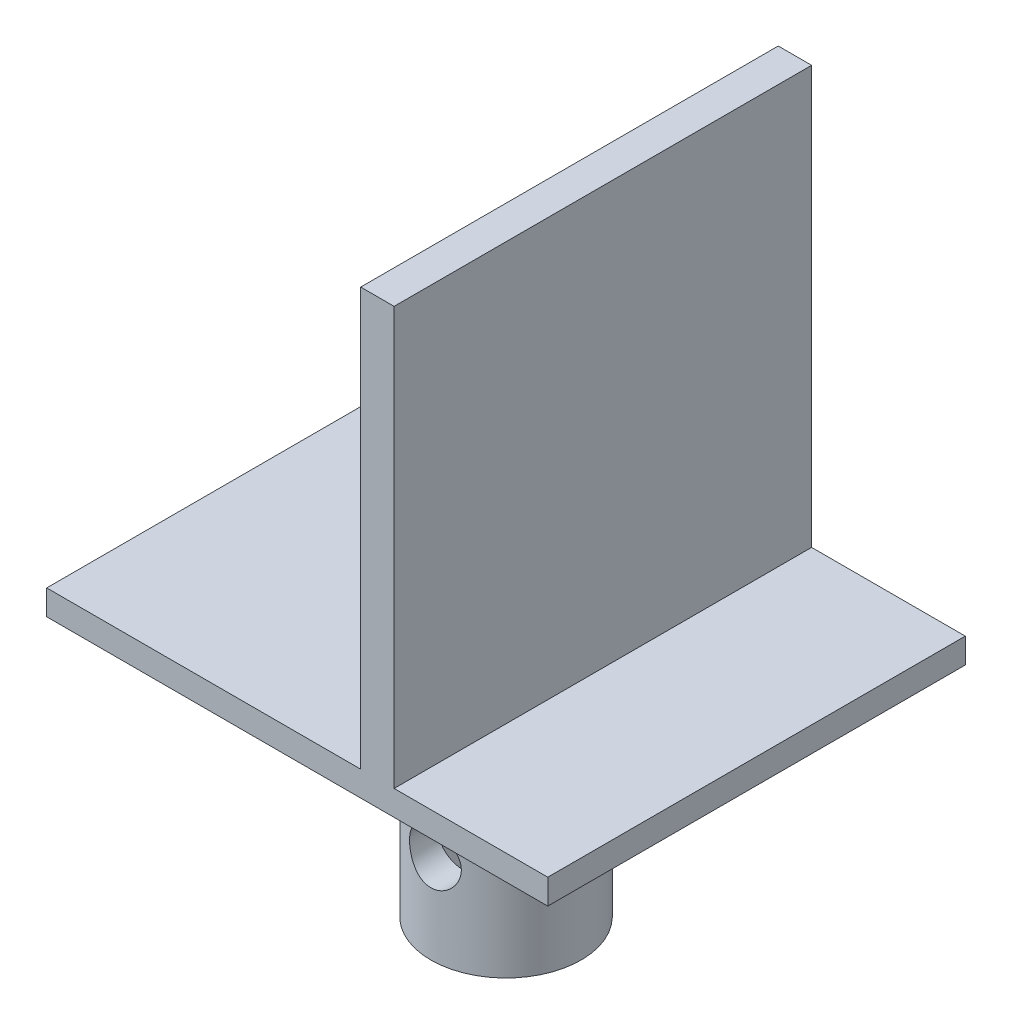
ISO-10303-21;
HEADER;
FILE_DESCRIPTION(('STEP AP214'),'2;1');
FILE_NAME('part.step','',(''),(''),'','','');
FILE_SCHEMA(('AUTOMOTIVE_DESIGN { 1 0 10303 214 1 1 1 1 }'));
ENDSEC;
DATA;
#1=APPLICATION_CONTEXT('core data for automotive mechanical design processes');
#2=APPLICATION_PROTOCOL_DEFINITION('international standard','automotive_design',2000,#1);
#3=PRODUCT_CONTEXT('',#1,'mechanical');
#4=PRODUCT('Part','Part','',(#3));
#5=PRODUCT_RELATED_PRODUCT_CATEGORY('part','',(#4));
#6=PRODUCT_DEFINITION_FORMATION('','',#4);
#7=PRODUCT_DEFINITION_CONTEXT('part definition',#1,'design');
#8=PRODUCT_DEFINITION('design','',#6,#7);
#9=PRODUCT_DEFINITION_SHAPE('','',#8);
#10=(LENGTH_UNIT() NAMED_UNIT(*) SI_UNIT(.MILLI.,.METRE.));
#11=(NAMED_UNIT(*) PLANE_ANGLE_UNIT() SI_UNIT($,.RADIAN.));
#12=(NAMED_UNIT(*) SI_UNIT($,.STERADIAN.) SOLID_ANGLE_UNIT());
#13=UNCERTAINTY_MEASURE_WITH_UNIT(LENGTH_MEASURE(1.E-05),#10,'distance_accuracy_value','');
#14=(GEOMETRIC_REPRESENTATION_CONTEXT(3) GLOBAL_UNCERTAINTY_ASSIGNED_CONTEXT((#13)) GLOBAL_UNIT_ASSIGNED_CONTEXT((#10,
#11,#12)) REPRESENTATION_CONTEXT('',''));
#15=CARTESIAN_POINT('',(0.,0.,0.));
#16=DIRECTION('',(0.,0.,1.));
#17=DIRECTION('',(1.,0.,0.));
#18=AXIS2_PLACEMENT_3D('',#15,#16,#17);
#19=CARTESIAN_POINT('',(0.,15.8,0.));
#20=DIRECTION('',(0.,-1.,0.));
#21=DIRECTION('',(0.,0.,-1.));
#22=AXIS2_PLACEMENT_3D('',#19,#20,#21);
#23=PLANE('',#22);
#24=DIRECTION('',(0.,0.,-1.));
#25=VECTOR('',#24,1.);
#26=CARTESIAN_POINT('',(5.8,15.8,12.5));
#27=LINE('',#26,#25);
#28=CARTESIAN_POINT('',(5.8,15.8,12.5));
#29=VERTEX_POINT('',#28);
#30=CARTESIAN_POINT('',(5.8,15.8,-12.5));
#31=VERTEX_POINT('',#30);
#32=EDGE_CURVE('E55',#29,#31,#27,.T.);
#33=ORIENTED_EDGE('',*,*,#32,.F.);
#34=DIRECTION('',(1.,0.,0.));
#35=VECTOR('',#34,1.);
#36=CARTESIAN_POINT('',(-15.,15.8,12.5));
#37=LINE('',#36,#35);
#38=CARTESIAN_POINT('',(15.,15.8,12.5));
#39=VERTEX_POINT('',#38);
#40=EDGE_CURVE('E160',#29,#39,#37,.T.);
#41=ORIENTED_EDGE('',*,*,#40,.T.);
#42=DIRECTION('',(0.,0.,-1.));
#43=VECTOR('',#42,1.);
#44=CARTESIAN_POINT('',(15.,15.8,12.5));
#45=LINE('',#44,#43);
#46=CARTESIAN_POINT('',(15.,15.8,-12.5));
#47=VERTEX_POINT('',#46);
#48=EDGE_CURVE('E152',#39,#47,#45,.T.);
#49=ORIENTED_EDGE('',*,*,#48,.T.);
#50=DIRECTION('',(-1.,0.,0.));
#51=VECTOR('',#50,1.);
#52=CARTESIAN_POINT('',(-15.,15.8,-12.5));
#53=LINE('',#52,#51);
#54=EDGE_CURVE('E156',#47,#31,#53,.T.);
#55=ORIENTED_EDGE('',*,*,#54,.T.);
#56=EDGE_LOOP('',(#33,#41,#49,#55));
#57=FACE_BOUND('',#56,.T.);
#58=ADVANCED_FACE('F37',(#57),#23,.F.);
#59=CARTESIAN_POINT('',(0.,15.8,0.));
#60=DIRECTION('',(0.,1.,0.));
#61=DIRECTION('',(0.,0.,1.));
#62=AXIS2_PLACEMENT_3D('',#59,#60,#61);
#63=CIRCLE('',#62,1.6);
#64=CARTESIAN_POINT('',(0.,15.8,1.6));
#65=VERTEX_POINT('',#64);
#66=EDGE_CURVE('E140',#65,#65,#63,.T.);
#67=ORIENTED_EDGE('',*,*,#66,.F.);
#68=EDGE_LOOP('',(#67));
#69=FACE_BOUND('',#68,.T.);
#70=DIRECTION('',(0.,0.,1.));
#71=VECTOR('',#70,1.);
#72=CARTESIAN_POINT('',(3.8,15.8,-12.5));
#73=LINE('',#72,#71);
#74=CARTESIAN_POINT('',(3.8,15.8,-12.5));
#75=VERTEX_POINT('',#74);
#76=CARTESIAN_POINT('',(3.8,15.8,12.5));
#77=VERTEX_POINT('',#76);
#78=EDGE_CURVE('E63',#75,#77,#73,.T.);
#79=ORIENTED_EDGE('',*,*,#78,.F.);
#80=CARTESIAN_POINT('',(-15.,15.8,-12.5));
#81=VERTEX_POINT('',#80);
#82=EDGE_CURVE('E139',#75,#81,#53,.T.);
#83=ORIENTED_EDGE('',*,*,#82,.T.);
#84=DIRECTION('',(0.,0.,1.));
#85=VECTOR('',#84,1.);
#86=CARTESIAN_POINT('',(-15.,15.8,12.5));
#87=LINE('',#86,#85);
#88=CARTESIAN_POINT('',(-15.,15.8,12.5));
#89=VERTEX_POINT('',#88);
#90=EDGE_CURVE('E158',#81,#89,#87,.T.);
#91=ORIENTED_EDGE('',*,*,#90,.T.);
#92=EDGE_CURVE('E161',#89,#77,#37,.T.);
#93=ORIENTED_EDGE('',*,*,#92,.T.);
#94=EDGE_LOOP('',(#79,#83,#91,#93));
#95=FACE_BOUND('',#94,.T.);
#96=ADVANCED_FACE('F241',(#69,#95),#23,.F.);
#97=CARTESIAN_POINT('',(0.,0.,0.));
#98=DIRECTION('',(0.,1.,0.));
#99=DIRECTION('',(0.,0.,1.));
#100=AXIS2_PLACEMENT_3D('',#97,#98,#99);
#101=PLANE('',#100);
#102=CARTESIAN_POINT('',(0.,0.,0.));
#103=DIRECTION('',(0.,1.,0.));
#104=DIRECTION('',(0.,0.,1.));
#105=AXIS2_PLACEMENT_3D('',#102,#103,#104);
#106=CIRCLE('',#105,4.5);
#107=CARTESIAN_POINT('',(0.,0.,4.5));
#108=VERTEX_POINT('',#107);
#109=EDGE_CURVE('E47',#108,#108,#106,.T.);
#110=ORIENTED_EDGE('',*,*,#109,.F.);
#111=EDGE_LOOP('',(#110));
#112=FACE_BOUND('',#111,.T.);
#113=CARTESIAN_POINT('',(0.,0.,0.));
#114=DIRECTION('',(0.,1.,0.));
#115=DIRECTION('',(0.,0.,1.));
#116=AXIS2_PLACEMENT_3D('',#113,#114,#115);
#117=CIRCLE('',#116,3.1);
#118=CARTESIAN_POINT('',(0.,0.,3.1));
#119=VERTEX_POINT('',#118);
#120=EDGE_CURVE('E228',#119,#119,#117,.T.);
#121=ORIENTED_EDGE('',*,*,#120,.T.);
#122=EDGE_LOOP('',(#121));
#123=FACE_BOUND('',#122,.T.);
#124=ADVANCED_FACE('F238',(#112,#123),#101,.F.);
#125=CARTESIAN_POINT('',(0.,14.3,0.));
#126=DIRECTION('',(0.,-1.,0.));
#127=DIRECTION('',(0.,0.,-1.));
#128=AXIS2_PLACEMENT_3D('',#125,#126,#127);
#129=CYLINDRICAL_SURFACE('',#128,4.5);
#130=CARTESIAN_POINT('',(0.,6.85,-4.5));
#131=CARTESIAN_POINT('',(-0.0844112457578997,6.85000098688728,-4.50000067498475));
#132=CARTESIAN_POINT('',(-0.168815510914255,6.84308235298128,-4.49760331814558));
#133=CARTESIAN_POINT('',(-0.335128310504061,6.81568220562156,-4.488276751476));
#134=CARTESIAN_POINT('',(-0.417036750892387,6.79520018174544,-4.48134737109495));
#135=CARTESIAN_POINT('',(-0.575936267944437,6.74146537536155,-4.46370738435514));
#136=CARTESIAN_POINT('',(-0.652935626003491,6.70823480160922,-4.45300335626998));
#137=CARTESIAN_POINT('',(-0.800266823584256,6.63004981513081,-4.42889974185601));
#138=CARTESIAN_POINT('',(-0.87059720834899,6.58509285241819,-4.41549956937654));
#139=CARTESIAN_POINT('',(-1.00517392756136,6.4830015946162,-4.38685738369943));
#140=CARTESIAN_POINT('',(-1.06914216474409,6.42551377606433,-4.37156911713487));
#141=CARTESIAN_POINT('',(-1.18674533040204,6.30074387775322,-4.34112114551387));
#142=CARTESIAN_POINT('',(-1.24037777182549,6.23345944750391,-4.32596147223702));
#143=CARTESIAN_POINT('',(-1.33741979634218,6.08844839462504,-4.29697089006417));
#144=CARTESIAN_POINT('',(-1.38045991867064,6.01046225677719,-4.28319591070303));
#145=CARTESIAN_POINT('',(-1.45269327295272,5.8478075859434,-4.25924185592437));
#146=CARTESIAN_POINT('',(-1.48189105943343,5.76314126164097,-4.24906159802171));
#147=CARTESIAN_POINT('',(-1.52455348914785,5.59270357415113,-4.23393854741069));
#148=CARTESIAN_POINT('',(-1.53854191577049,5.50707921252927,-4.2288219757491));
#149=CARTESIAN_POINT('',(-1.55202626307294,5.33455757176489,-4.22389287384626));
#150=CARTESIAN_POINT('',(-1.55152702780461,5.24766072779854,-4.22407857075382));
#151=CARTESIAN_POINT('',(-1.5364552893331,5.07960717729957,-4.22958135760731));
#152=CARTESIAN_POINT('',(-1.52257679429198,4.99837848064107,-4.23464538950798));
#153=CARTESIAN_POINT('',(-1.48227653208473,4.83948210457874,-4.24891851388564));
#154=CARTESIAN_POINT('',(-1.45585316715558,4.76181488015989,-4.25812813435304));
#155=CARTESIAN_POINT('',(-1.39077825177585,4.61071147944572,-4.27982769024448));
#156=CARTESIAN_POINT('',(-1.35192777452719,4.53736887987872,-4.29237038476014));
#157=CARTESIAN_POINT('',(-1.2632396196249,4.39802921480025,-4.31930189756565));
#158=CARTESIAN_POINT('',(-1.21339859933375,4.33203439323379,-4.33369127694408));
#159=CARTESIAN_POINT('',(-1.10085151292632,4.20537803630775,-4.36367934319863));
#160=CARTESIAN_POINT('',(-1.03758136833315,4.14522201528507,-4.37930062966038));
#161=CARTESIAN_POINT('',(-0.901661158563292,4.03623742852,-4.40929074897612));
#162=CARTESIAN_POINT('',(-0.829010068918356,3.98741010158565,-4.42365944475048));
#163=CARTESIAN_POINT('',(-0.675262923964719,3.90202470989667,-4.4497369357377));
#164=CARTESIAN_POINT('',(-0.594081261287455,3.86561045459386,-4.46141407767136));
#165=CARTESIAN_POINT('',(-0.426244860993738,3.80711528264219,-4.4805619129214));
#166=CARTESIAN_POINT('',(-0.339592172411808,3.78502903433439,-4.48803417079866));
#167=CARTESIAN_POINT('',(-0.167546658901882,3.75673179177389,-4.49766704671657));
#168=CARTESIAN_POINT('',(-0.0822787133035284,3.74983835233336,-4.50005582746344));
#169=CARTESIAN_POINT('',(0.0882177823376301,3.75016733661719,-4.49994221303783));
#170=CARTESIAN_POINT('',(0.173446336725034,3.7573871931293,-4.49744070740972));
#171=CARTESIAN_POINT('',(0.338657836079041,3.78520276696595,-4.48797835218554));
#172=CARTESIAN_POINT('',(0.418721468906692,3.80537242219893,-4.48115963905442));
#173=CARTESIAN_POINT('',(0.57429040049466,3.8579751591538,-4.46389080403277));
#174=CARTESIAN_POINT('',(0.649795110227239,3.89040982163944,-4.45344021406533));
#175=CARTESIAN_POINT('',(0.796398179598675,3.96759637989019,-4.42960707813092));
#176=CARTESIAN_POINT('',(0.867320514776627,4.0126596924286,-4.41615242861785));
#177=CARTESIAN_POINT('',(1.00081442868829,4.11346241327732,-4.38782802560196));
#178=CARTESIAN_POINT('',(1.06338329670506,4.16920527290276,-4.37295781541538));
#179=CARTESIAN_POINT('',(1.18156817866963,4.292989962079,-4.34255718231333));
#180=CARTESIAN_POINT('',(1.23669749306648,4.36149838952029,-4.32702985654681));
#181=CARTESIAN_POINT('',(1.33474670692027,4.50712218172922,-4.29779911143196));
#182=CARTESIAN_POINT('',(1.37766629660505,4.58423776479939,-4.28409573836372));
#183=CARTESIAN_POINT('',(1.44992864430844,4.74505107230025,-4.26018344938775));
#184=CARTESIAN_POINT('',(1.47928119530185,4.82874399784877,-4.24997201431499));
#185=CARTESIAN_POINT('',(1.52332795379709,5.00032260300098,-4.23438643444276));
#186=CARTESIAN_POINT('',(1.53802936678966,5.08820619930873,-4.22900991194032));
#187=CARTESIAN_POINT('',(1.55177178830967,5.26049292340695,-4.22398537227285));
#188=CARTESIAN_POINT('',(1.55162612410019,5.34482317529373,-4.22403984010122));
#189=CARTESIAN_POINT('',(1.53770139040204,5.51218948644983,-4.22912853088892));
#190=CARTESIAN_POINT('',(1.5239232412872,5.59522563270406,-4.23416241767132));
#191=CARTESIAN_POINT('',(1.48371636052575,5.75584501502134,-4.24841411375326));
#192=CARTESIAN_POINT('',(1.45756832353841,5.83350743489417,-4.25753886486137));
#193=CARTESIAN_POINT('',(1.39359582829707,5.98339970249702,-4.27890436288881));
#194=CARTESIAN_POINT('',(1.3557686725035,6.05562829037038,-4.29114582956486));
#195=CARTESIAN_POINT('',(1.26748274106293,6.19620885987046,-4.31806759352077));
#196=CARTESIAN_POINT('',(1.21652268740575,6.26422937627379,-4.33283421217731));
#197=CARTESIAN_POINT('',(1.10424618396128,6.3910155842314,-4.36279870574256));
#198=CARTESIAN_POINT('',(1.04292671332931,6.44977856656719,-4.37799670536496));
#199=CARTESIAN_POINT('',(0.908533164448209,6.55891758107121,-4.40789038140682));
#200=CARTESIAN_POINT('',(0.83506911752254,6.60882865669005,-4.4225369396473));
#201=CARTESIAN_POINT('',(0.680301484696209,6.69554778519266,-4.44897093345745));
#202=CARTESIAN_POINT('',(0.598999273220981,6.73235813000325,-4.46075886901803));
#203=CARTESIAN_POINT('',(0.432700101686367,6.79092776983934,-4.47991225805818));
#204=CARTESIAN_POINT('',(0.347826133026447,6.81300470498523,-4.48737056011597));
#205=CARTESIAN_POINT('',(0.17529832568854,6.84253793166177,-4.49741328859762));
#206=CARTESIAN_POINT('',(0.0876453999632326,6.84999897530087,-4.49999929915371));
#207=CARTESIAN_POINT('',(0.,6.85,-4.5));
#208=B_SPLINE_CURVE_WITH_KNOTS('',3,(#130,#131,#132,#133,#134,#135,#136,#137,#138,#139,#140,
#141,#142,#143,#144,#145,#146,#147,#148,#149,#150,#151,#152,#153,#154,#155,#156,#157,#158,#159,
#160,#161,#162,#163,#164,#165,#166,#167,#168,#169,#170,#171,#172,#173,#174,#175,#176,#177,#178,
#179,#180,#181,#182,#183,#184,#185,#186,#187,#188,#189,#190,#191,#192,#193,#194,#195,#196,#197,
#198,#199,#200,#201,#202,#203,#204,#205,#206,#207),.UNSPECIFIED.,.T.,.F.,(4,2,2,2,2,2,2,2,2,2,2,
2,2,2,2,2,2,2,2,2,2,2,2,2,2,2,2,2,2,2,2,2,2,2,2,2,2,2,4),(0.,0.252911005872154,0.50583152992377,
0.758313437091753,1.01085029408286,1.27173813706169,1.53268867803223,1.80174816030347,
2.07071905271088,2.33010103515682,2.58939629240825,2.83592697222035,3.08248905955764,
3.33321407090094,3.58401544258284,3.84885953372345,4.11373257228915,4.38157751679093,
4.64932273505168,4.90477259769653,5.1601759982677,5.40757928022737,5.65501445939691,
5.90918889170316,6.16344560468376,6.43007880381508,6.69671876707778,6.96316596225806,
7.22948205283423,7.48121755498931,7.73293606281367,7.97919818757991,8.22551723439856,
8.48317411129175,8.74090625198943,9.00963762937433,9.27832197001198,9.54100849552516,
9.8036095987993),.UNSPECIFIED.);
#209=CARTESIAN_POINT('',(0.,6.85,-4.5));
#210=VERTEX_POINT('',#209);
#211=EDGE_CURVE('E211',#210,#210,#208,.T.);
#212=ORIENTED_EDGE('',*,*,#211,.T.);
#213=EDGE_LOOP('',(#212));
#214=FACE_BOUND('',#213,.T.);
#215=CARTESIAN_POINT('',(1.55,5.3,4.22463016132773));
#216=CARTESIAN_POINT('',(1.55000101648973,5.21575674611695,4.22462932996597));
#217=CARTESIAN_POINT('',(1.54310886725736,5.13152053455058,4.22717750648441));
#218=CARTESIAN_POINT('',(1.51582348983939,4.96555518183629,4.23703733210377));
#219=CARTESIAN_POINT('',(1.49542877799695,4.88382631722749,4.24434950466951));
#220=CARTESIAN_POINT('',(1.44194888576098,4.72530917372356,4.26281291866779));
#221=CARTESIAN_POINT('',(1.40888995559925,4.64851105636324,4.27395621413117));
#222=CARTESIAN_POINT('',(1.33111065768993,4.50152458504806,4.29881443706124));
#223=CARTESIAN_POINT('',(1.28638745331447,4.43133784456928,4.3125299898454));
#224=CARTESIAN_POINT('',(1.18454604444956,4.29663183678457,4.34163034204318));
#225=CARTESIAN_POINT('',(1.12702162336343,4.2324290225721,4.3570587527152));
#226=CARTESIAN_POINT('',(1.00207632126868,4.11436394240221,4.38747908186884));
#227=CARTESIAN_POINT('',(0.934653730287424,4.06050346686855,4.40247092439313));
#228=CARTESIAN_POINT('',(0.789489383833411,3.96319372365394,4.43083730162968));
#229=CARTESIAN_POINT('',(0.711511062274522,3.92007920049043,4.44415461436952));
#230=CARTESIAN_POINT('',(0.548870506500739,3.84770641767961,4.46715495887712));
#231=CARTESIAN_POINT('',(0.464210212297967,3.81844415337348,4.47683904083607));
#232=CARTESIAN_POINT('',(0.29392922284534,3.77568899554056,4.49117272513203));
#233=CARTESIAN_POINT('',(0.208459638580764,3.76165330536828,4.49599515208323));
#234=CARTESIAN_POINT('',(0.0362514239351594,3.74802041761557,4.50067737170093));
#235=CARTESIAN_POINT('',(-0.050486851105961,3.74841925173279,4.50053852830727));
#236=CARTESIAN_POINT('',(-0.218915947468002,3.76330698916361,4.49542914182594));
#237=CARTESIAN_POINT('',(-0.300666104758727,3.77720562287302,4.4906610148277));
#238=CARTESIAN_POINT('',(-0.460593440438585,3.81771802117257,4.47708585415062));
#239=CARTESIAN_POINT('',(-0.538770372448995,3.84433266110381,4.46827854242512));
#240=CARTESIAN_POINT('',(-0.69058356440591,3.90984756288369,4.44736445838373));
#241=CARTESIAN_POINT('',(-0.764143765640562,3.94890971934316,4.43521451312276));
#242=CARTESIAN_POINT('',(-0.903834591153738,4.03807512496967,4.4088709798034));
#243=CARTESIAN_POINT('',(-0.96996304605704,4.08818158546662,4.39467679776334));
#244=CARTESIAN_POINT('',(-1.09641742517555,4.20095521223963,4.36489409089641));
#245=CARTESIAN_POINT('',(-1.15628719891386,4.26412557475527,4.34927133584979));
#246=CARTESIAN_POINT('',(-1.26473733477207,4.39973388083113,4.31898340257333));
#247=CARTESIAN_POINT('',(-1.31331570274819,4.47217345790429,4.30431839381672));
#248=CARTESIAN_POINT('',(-1.39849441029571,4.62579865875816,4.27741142495602));
#249=CARTESIAN_POINT('',(-1.43488891406876,4.70710650501841,4.26521236224826));
#250=CARTESIAN_POINT('',(-1.49331005957463,4.87522420772478,4.24511376491246));
#251=CARTESIAN_POINT('',(-1.51534321620687,4.9620315497361,4.23721228099511));
#252=CARTESIAN_POINT('',(-1.54345989663797,5.13424069140105,4.2270492877295));
#253=CARTESIAN_POINT('',(-1.55025534009948,5.21951140009021,4.22453628728762));
#254=CARTESIAN_POINT('',(-1.54973008831735,5.3899935917644,4.22472938157166));
#255=CARTESIAN_POINT('',(-1.5424121851587,5.47520508312841,4.22743444399283));
#256=CARTESIAN_POINT('',(-1.51450933995046,5.63981005215849,4.23750688917032));
#257=CARTESIAN_POINT('',(-1.4944327938826,5.71930185200918,4.24469542272365));
#258=CARTESIAN_POINT('',(-1.44220010638519,5.87376773781414,4.26272411644448));
#259=CARTESIAN_POINT('',(-1.41004173385307,5.94874098637639,4.27356495102959));
#260=CARTESIAN_POINT('',(-1.33334369890451,6.09481148794107,4.29812319571649));
#261=CARTESIAN_POINT('',(-1.28842730579839,6.16569645192045,4.31192439423392));
#262=CARTESIAN_POINT('',(-1.18790826451313,6.29917945434685,4.3406915189207));
#263=CARTESIAN_POINT('',(-1.13230226325512,6.36177488212863,4.35565780967325));
#264=CARTESIAN_POINT('',(-1.00855656849839,6.48026480725094,4.3860086827864));
#265=CARTESIAN_POINT('',(-0.939915967490389,6.53564254809802,4.40137462925332));
#266=CARTESIAN_POINT('',(-0.793937115000877,6.6341343855078,4.43003259095419));
#267=CARTESIAN_POINT('',(-0.716599105111644,6.67724882259707,4.44332466377068));
#268=CARTESIAN_POINT('',(-0.555737105079663,6.74961532168857,4.4662859281167));
#269=CARTESIAN_POINT('',(-0.472253229090395,6.77894940728158,4.47597648260678));
#270=CARTESIAN_POINT('',(-0.301134538547422,6.82302850175413,4.49073257772297));
#271=CARTESIAN_POINT('',(-0.21350134979431,6.83777917599928,4.49579991431831));
#272=CARTESIAN_POINT('',(-0.0412828673221117,6.85173604130049,4.50059402387461));
#273=CARTESIAN_POINT('',(0.0432360325963029,6.85168185445784,4.50057490745951));
#274=CARTESIAN_POINT('',(0.211004563751867,6.83787502629974,4.49583336026566));
#275=CARTESIAN_POINT('',(0.294254309279125,6.824123625935,4.49111135556282));
#276=CARTESIAN_POINT('',(0.455627579809447,6.78381242361161,4.47759418085758));
#277=CARTESIAN_POINT('',(0.533816226343149,6.75748652286772,4.46887350517174));
#278=CARTESIAN_POINT('',(0.684691665398952,6.69299387858438,4.44825823776633));
#279=CARTESIAN_POINT('',(0.757377439817753,6.65482495055758,4.43636306055564));
#280=CARTESIAN_POINT('',(0.898234527273862,6.56604492618065,4.41004618867863));
#281=CARTESIAN_POINT('',(0.966124782811378,6.51501184091004,4.39554493246377));
#282=CARTESIAN_POINT('',(1.09261664927526,6.40265589163046,4.36582389443807));
#283=CARTESIAN_POINT('',(1.1512151842788,6.34132963395123,4.35060387684407));
#284=CARTESIAN_POINT('',(1.26000553156077,6.20701002154622,4.32038341639379));
#285=CARTESIAN_POINT('',(1.3097331041833,6.1336310510546,4.30541992218734));
#286=CARTESIAN_POINT('',(1.39612804645191,5.97908684559913,4.27818744490014));
#287=CARTESIAN_POINT('',(1.43279770519098,5.89792297852169,4.26591798969067));
#288=CARTESIAN_POINT('',(1.49114128767276,5.73192407834298,4.24587270975996));
#289=CARTESIAN_POINT('',(1.51313633197313,5.64721399011321,4.23800131627066));
#290=CARTESIAN_POINT('',(1.5425621631624,5.47499929223424,4.22738152800979));
#291=CARTESIAN_POINT('',(1.54999894426407,5.38749584780914,4.224631024788));
#292=CARTESIAN_POINT('',(1.55,5.3,4.22463016132773));
#293=B_SPLINE_CURVE_WITH_KNOTS('',3,(#215,#216,#217,#218,#219,#220,#221,#222,#223,#224,#225,
#226,#227,#228,#229,#230,#231,#232,#233,#234,#235,#236,#237,#238,#239,#240,#241,#242,#243,#244,
#245,#246,#247,#248,#249,#250,#251,#252,#253,#254,#255,#256,#257,#258,#259,#260,#261,#262,#263,
#264,#265,#266,#267,#268,#269,#270,#271,#272,#273,#274,#275,#276,#277,#278,#279,#280,#281,#282,
#283,#284,#285,#286,#287,#288,#289,#290,#291,#292),.UNSPECIFIED.,.T.,.F.,(4,2,2,2,2,2,2,2,2,2,2,
2,2,2,2,2,2,2,2,2,2,2,2,2,2,2,2,2,2,2,2,2,2,2,2,2,2,2,4),(0.,0.252405285294266,
0.504838309396534,0.756750900179922,1.00872481065168,1.27026776159797,1.53185594906038,
1.80078816116429,2.06964257798011,2.32856143627173,2.58740911379657,2.83542581795459,
3.08345959748178,3.3348609043876,3.5863354074002,3.85039786665386,4.11450692587036,
4.38287589322982,4.65112303246934,4.90655048812577,5.16192741699874,5.40771678296066,
5.65355156018974,5.9075748883732,6.16167802810603,6.42897625359523,6.69626705604106,
6.96194607193487,7.22752183620541,7.47983250373037,7.73212031429765,7.97988791025925,
8.22770123500711,8.48504341446102,8.74247060718338,9.0108597982636,9.27920191669358,
9.54146046082689,9.80361100001415),.UNSPECIFIED.);
#294=CARTESIAN_POINT('',(1.55,5.3,4.22463016132773));
#295=VERTEX_POINT('',#294);
#296=EDGE_CURVE('E190',#295,#295,#293,.T.);
#297=ORIENTED_EDGE('',*,*,#296,.T.);
#298=EDGE_LOOP('',(#297));
#299=FACE_BOUND('',#298,.T.);
#300=CARTESIAN_POINT('',(0.,14.3,0.));
#301=DIRECTION('',(0.,1.,0.));
#302=DIRECTION('',(0.,0.,1.));
#303=AXIS2_PLACEMENT_3D('',#300,#301,#302);
#304=CIRCLE('',#303,4.5);
#305=CARTESIAN_POINT('',(0.,14.3,4.5));
#306=VERTEX_POINT('',#305);
#307=EDGE_CURVE('E11',#306,#306,#304,.T.);
#308=ORIENTED_EDGE('',*,*,#307,.F.);
#309=EDGE_LOOP('',(#308));
#310=FACE_BOUND('',#309,.T.);
#311=ORIENTED_EDGE('',*,*,#109,.T.);
#312=EDGE_LOOP('',(#311));
#313=FACE_BOUND('',#312,.T.);
#314=ADVANCED_FACE('F39',(#214,#299,#310,#313),#129,.T.);
#315=CARTESIAN_POINT('',(0.,14.3,0.));
#316=DIRECTION('',(0.,-1.,0.));
#317=DIRECTION('',(0.,0.,-1.));
#318=AXIS2_PLACEMENT_3D('',#315,#316,#317);
#319=CYLINDRICAL_SURFACE('',#318,3.1);
#320=CARTESIAN_POINT('',(0.,6.85,-3.1));
#321=CARTESIAN_POINT('',(-0.0814865425744118,6.84999488140835,-3.09999555777814));
#322=CARTESIAN_POINT('',(-0.163070229531222,6.84353638666236,-3.09675261080622));
#323=CARTESIAN_POINT('',(-0.323826364666789,6.81798803547062,-3.08409941857593));
#324=CARTESIAN_POINT('',(-0.402993934406126,6.79887419085339,-3.07467746134825));
#325=CARTESIAN_POINT('',(-0.556346994564696,6.74894959664423,-3.05065233075232));
#326=CARTESIAN_POINT('',(-0.630550544555677,6.71818430441565,-3.03606930725183));
#327=CARTESIAN_POINT('',(-0.772632556050228,6.64606553688427,-3.0030595359943));
#328=CARTESIAN_POINT('',(-0.840511515684591,6.60471289641426,-2.98463309131964));
#329=CARTESIAN_POINT('',(-0.972637117530959,6.50974826329781,-2.94432200299996));
#330=CARTESIAN_POINT('',(-1.03641557723927,6.45554595717856,-2.92229558647683));
#331=CARTESIAN_POINT('',(-1.15440813954382,6.33769170716709,-2.87772953882452));
#332=CARTESIAN_POINT('',(-1.20861495381549,6.27403262975271,-2.85518953124004));
#333=CARTESIAN_POINT('',(-1.31014060069793,6.13315080823876,-2.81013374355889));
#334=CARTESIAN_POINT('',(-1.35659927010504,6.05525904756384,-2.78775539803704));
#335=CARTESIAN_POINT('',(-1.43556075168058,5.89153062922137,-2.74793267097097));
#336=CARTESIAN_POINT('',(-1.46807353319782,5.80569970047974,-2.73048476790834));
#337=CARTESIAN_POINT('',(-1.51610528539231,5.63376908659602,-2.70409693908603));
#338=CARTESIAN_POINT('',(-1.53252507847468,5.54799309929554,-2.69471020954756));
#339=CARTESIAN_POINT('',(-1.55066183962871,5.37443280144181,-2.68431929420218));
#340=CARTESIAN_POINT('',(-1.55239333697826,5.28665056164971,-2.68330682482097));
#341=CARTESIAN_POINT('',(-1.54176529511705,5.12285666231118,-2.68941941898735));
#342=CARTESIAN_POINT('',(-1.53106606728207,5.04669275160427,-2.69558583676121));
#343=CARTESIAN_POINT('',(-1.49875676603824,4.89743104047178,-2.71368154537468));
#344=CARTESIAN_POINT('',(-1.47714321704136,4.82433422477676,-2.72561267189253));
#345=CARTESIAN_POINT('',(-1.4232251595983,4.68119484452323,-2.75415588439749));
#346=CARTESIAN_POINT('',(-1.39068335402979,4.61126308188203,-2.77087053029198));
#347=CARTESIAN_POINT('',(-1.3160146158854,4.47751684648549,-2.80710276636176));
#348=CARTESIAN_POINT('',(-1.27388337790932,4.41370513981986,-2.82662161409296));
#349=CARTESIAN_POINT('',(-1.17500238511482,4.285492058248,-2.86925394750093));
#350=CARTESIAN_POINT('',(-1.11707641047238,4.22204184595696,-2.89250940866957));
#351=CARTESIAN_POINT('',(-0.991311147049125,4.1053601011841,-2.93798816115631));
#352=CARTESIAN_POINT('',(-0.923467147690138,4.05213345234748,-2.96021095536142));
#353=CARTESIAN_POINT('',(-0.775800584039361,3.95508722540392,-3.00238080288594));
#354=CARTESIAN_POINT('',(-0.69556806697908,3.9118192677091,-3.02217425451111));
#355=CARTESIAN_POINT('',(-0.527722634007631,3.83974960498334,-3.05594715737926));
#356=CARTESIAN_POINT('',(-0.440115643211174,3.81093641322649,-3.06993122362507));
#357=CARTESIAN_POINT('',(-0.267788062074085,3.77096312423915,-3.08952717299225));
#358=CARTESIAN_POINT('',(-0.183429372349902,3.75853858459249,-3.0957365436703));
#359=CARTESIAN_POINT('',(-0.0136083799214916,3.74772966674155,-3.10113170861611));
#360=CARTESIAN_POINT('',(0.0718533807983618,3.74933863725883,-3.10032083018044));
#361=CARTESIAN_POINT('',(0.234411106578283,3.76582036704905,-3.09211347992824));
#362=CARTESIAN_POINT('',(0.311642082477395,3.77965542573149,-3.08523230816661));
#363=CARTESIAN_POINT('',(0.462530683068012,3.81856901143744,-3.06624365538002));
#364=CARTESIAN_POINT('',(0.536187912821188,3.84364877800292,-3.05413559818338));
#365=CARTESIAN_POINT('',(0.680277343096841,3.9049976229712,-3.02535589691061));
#366=CARTESIAN_POINT('',(0.750557115358998,3.94156612768025,-3.00856366742928));
#367=CARTESIAN_POINT('',(0.884215110633873,4.02451668025218,-2.97203160191997));
#368=CARTESIAN_POINT('',(0.947590376153719,4.07090290862287,-2.95229051128754));
#369=CARTESIAN_POINT('',(1.07223991839829,4.17742865926261,-2.90947743071107));
#370=CARTESIAN_POINT('',(1.13269672061949,4.23847144608998,-2.88626871507424));
#371=CARTESIAN_POINT('',(1.24287729773423,4.36988398448048,-2.84056706993671));
#372=CARTESIAN_POINT('',(1.29259364785341,4.44026013421428,-2.81807464470073));
#373=CARTESIAN_POINT('',(1.38214726744248,4.59264766396812,-2.77529347920058));
#374=CARTESIAN_POINT('',(1.42138951849039,4.67505746244645,-2.75516420863044));
#375=CARTESIAN_POINT('',(1.48502838019879,4.8466406047412,-2.72139812055909));
#376=CARTESIAN_POINT('',(1.50944411959388,4.93580506602368,-2.70775294243712));
#377=CARTESIAN_POINT('',(1.54048561557365,5.10921084547129,-2.69020326589993));
#378=CARTESIAN_POINT('',(1.54859414442845,5.19310309282463,-2.68548944370851));
#379=CARTESIAN_POINT('',(1.55106818928312,5.36114295410502,-2.68406299694485));
#380=CARTESIAN_POINT('',(1.54543966226603,5.44529044154369,-2.68734690420904));
#381=CARTESIAN_POINT('',(1.52198549466963,5.60299942737683,-2.70068686179169));
#382=CARTESIAN_POINT('',(1.5053728872317,5.67680572872435,-2.7100679644812));
#383=CARTESIAN_POINT('',(1.46192180524784,5.82050258510777,-2.73375075090861));
#384=CARTESIAN_POINT('',(1.43508004129788,5.89039187224265,-2.74805401732986));
#385=CARTESIAN_POINT('',(1.36991440521588,6.02946851902913,-2.7811422206503));
#386=CARTESIAN_POINT('',(1.33094026361434,6.098293247835,-2.80016369713677));
#387=CARTESIAN_POINT('',(1.24333400603796,6.22887553108095,-2.84014764034033));
#388=CARTESIAN_POINT('',(1.19469686542442,6.29062938230772,-2.86111111383196));
#389=CARTESIAN_POINT('',(1.08221515632513,6.41312007264975,-2.90566600895043));
#390=CARTESIAN_POINT('',(1.01724085564576,6.47282160864295,-2.92926724125274));
#391=CARTESIAN_POINT('',(0.877539949661455,6.58070762432467,-2.97410516002893));
#392=CARTESIAN_POINT('',(0.802808121123056,6.62888589617836,-2.99534056870602));
#393=CARTESIAN_POINT('',(0.644693975013566,6.71241636220371,-3.03331914828133));
#394=CARTESIAN_POINT('',(0.561254230853933,6.74767546231653,-3.05002949565596));
#395=CARTESIAN_POINT('',(0.388650256764034,6.80320266002399,-3.0767707901343));
#396=CARTESIAN_POINT('',(0.299503089363105,6.82351336254886,-3.08682071212755));
#397=CARTESIAN_POINT('',(0.174533017060888,6.8405409871829,-3.09527965965891));
#398=CARTESIAN_POINT('',(0.139750913134426,6.84408309334283,-3.09704516277389));
#399=CARTESIAN_POINT('',(0.0699851842978925,6.84881373154683,-3.09940630314064));
#400=CARTESIAN_POINT('',(0.0350015538522744,6.85000219862882,-3.1000019081024));
#401=CARTESIAN_POINT('',(0.,6.85,-3.1));
#402=B_SPLINE_CURVE_WITH_KNOTS('',3,(#320,#321,#322,#323,#324,#325,#326,#327,#328,#329,#330,
#331,#332,#333,#334,#335,#336,#337,#338,#339,#340,#341,#342,#343,#344,#345,#346,#347,#348,#349,
#350,#351,#352,#353,#354,#355,#356,#357,#358,#359,#360,#361,#362,#363,#364,#365,#366,#367,#368,
#369,#370,#371,#372,#373,#374,#375,#376,#377,#378,#379,#380,#381,#382,#383,#384,#385,#386,#387,
#388,#389,#390,#391,#392,#393,#394,#395,#396,#397,#398,#399,#400,#401),.UNSPECIFIED.,.T.,.F.,(4,
2,2,2,2,2,2,2,2,2,2,2,2,2,2,2,2,2,2,2,2,2,2,2,2,2,2,2,2,2,2,2,2,2,2,2,2,2,2,2,4),(0.,
0.244317599001453,0.489099632049256,0.732936341013063,0.97675382890143,1.23532172601304,
1.49408566836375,1.77291675967667,2.05154819242335,2.31349918817356,2.57519103859982,
2.80558854234447,3.03605946084802,3.27189872261155,3.50784407953344,3.77370659067511,
4.03969578627964,4.31803684432383,4.59615636214033,4.85124100230586,5.10620474992788,
5.34140705084489,5.57663528527944,5.81858926843243,6.06064648659926,6.32647396498849,
6.59248462353919,6.87137757350675,7.14990993515449,7.40170426629722,7.65338942790251,
7.88109791885726,8.10887969621944,8.35196508009445,8.59517719772628,8.86794126273616,
9.14085194240931,9.41569221178466,9.68974608362781,9.79468684207571,9.89963049692152),.UNSPECIFIED.);
#403=CARTESIAN_POINT('',(0.,6.85,-3.1));
#404=VERTEX_POINT('',#403);
#405=EDGE_CURVE('E182',#404,#404,#402,.T.);
#406=ORIENTED_EDGE('',*,*,#405,.F.);
#407=EDGE_LOOP('',(#406));
#408=FACE_BOUND('',#407,.T.);
#409=DIRECTION('',(0.,1.,0.));
#410=VECTOR('',#409,1.);
#411=CARTESIAN_POINT('',(1.68819430161341,3.05,2.6));
#412=LINE('',#411,#410);
#413=CARTESIAN_POINT('',(1.68819430161341,3.05,2.6));
#414=VERTEX_POINT('',#413);
#415=CARTESIAN_POINT('',(1.68819430161341,14.3,2.6));
#416=VERTEX_POINT('',#415);
#417=EDGE_CURVE('E223',#414,#416,#412,.T.);
#418=ORIENTED_EDGE('',*,*,#417,.T.);
#419=CARTESIAN_POINT('',(0.,14.3,0.));
#420=DIRECTION('',(0.,1.,0.));
#421=DIRECTION('',(0.,0.,1.));
#422=AXIS2_PLACEMENT_3D('',#419,#420,#421);
#423=CIRCLE('',#422,3.1);
#424=CARTESIAN_POINT('',(-1.68819430161341,14.3,2.6));
#425=VERTEX_POINT('',#424);
#426=EDGE_CURVE('E230',#416,#425,#423,.T.);
#427=ORIENTED_EDGE('',*,*,#426,.T.);
#428=DIRECTION('',(0.,1.,0.));
#429=VECTOR('',#428,1.);
#430=CARTESIAN_POINT('',(-1.68819430161341,3.05,2.6));
#431=LINE('',#430,#429);
#432=CARTESIAN_POINT('',(-1.68819430161341,3.05,2.6));
#433=VERTEX_POINT('',#432);
#434=EDGE_CURVE('E226',#433,#425,#431,.T.);
#435=ORIENTED_EDGE('',*,*,#434,.F.);
#436=CARTESIAN_POINT('',(0.,3.05,0.));
#437=DIRECTION('',(0.,1.,0.));
#438=DIRECTION('',(0.,0.,1.));
#439=AXIS2_PLACEMENT_3D('',#436,#437,#438);
#440=CIRCLE('',#439,3.1);
#441=EDGE_CURVE('E218',#433,#414,#440,.T.);
#442=ORIENTED_EDGE('',*,*,#441,.T.);
#443=EDGE_LOOP('',(#418,#427,#435,#442));
#444=FACE_BOUND('',#443,.T.);
#445=ORIENTED_EDGE('',*,*,#120,.F.);
#446=EDGE_LOOP('',(#445));
#447=FACE_BOUND('',#446,.T.);
#448=ADVANCED_FACE('F195',(#408,#444,#447),#319,.F.);
#449=CARTESIAN_POINT('',(-1.68819430161341,3.05,2.6));
#450=DIRECTION('',(0.,0.,-1.));
#451=DIRECTION('',(-1.,0.,0.));
#452=AXIS2_PLACEMENT_3D('',#449,#450,#451);
#453=PLANE('',#452);
#454=CARTESIAN_POINT('',(0.,5.3,2.6));
#455=DIRECTION('',(0.,0.,-1.));
#456=DIRECTION('',(-1.,0.,0.));
#457=AXIS2_PLACEMENT_3D('',#454,#455,#456);
#458=CIRCLE('',#457,1.55);
#459=CARTESIAN_POINT('',(-1.55,5.3,2.6));
#460=VERTEX_POINT('',#459);
#461=EDGE_CURVE('E42',#460,#460,#458,.T.);
#462=ORIENTED_EDGE('',*,*,#461,.F.);
#463=EDGE_LOOP('',(#462));
#464=FACE_BOUND('',#463,.T.);
#465=DIRECTION('',(-1.,0.,0.));
#466=VECTOR('',#465,1.);
#467=CARTESIAN_POINT('',(-1.68819430161341,14.3,2.6));
#468=LINE('',#467,#466);
#469=EDGE_CURVE('E217',#416,#425,#468,.T.);
#470=ORIENTED_EDGE('',*,*,#469,.F.);
#471=ORIENTED_EDGE('',*,*,#417,.F.);
#472=DIRECTION('',(-1.,0.,0.));
#473=VECTOR('',#472,1.);
#474=CARTESIAN_POINT('',(-1.68819430161341,3.05,2.6));
#475=LINE('',#474,#473);
#476=EDGE_CURVE('E220',#414,#433,#475,.T.);
#477=ORIENTED_EDGE('',*,*,#476,.T.);
#478=ORIENTED_EDGE('',*,*,#434,.T.);
#479=EDGE_LOOP('',(#470,#471,#477,#478));
#480=FACE_BOUND('',#479,.T.);
#481=ADVANCED_FACE('F245',(#464,#480),#453,.T.);
#482=CARTESIAN_POINT('',(0.,3.05,0.));
#483=DIRECTION('',(0.,1.,0.));
#484=DIRECTION('',(0.,0.,1.));
#485=AXIS2_PLACEMENT_3D('',#482,#483,#484);
#486=PLANE('',#485);
#487=ORIENTED_EDGE('',*,*,#441,.F.);
#488=ORIENTED_EDGE('',*,*,#476,.F.);
#489=EDGE_LOOP('',(#487,#488));
#490=FACE_BOUND('',#489,.T.);
#491=ADVANCED_FACE('F208',(#490),#486,.F.);
#492=CARTESIAN_POINT('',(0.,5.3,-4.5));
#493=DIRECTION('',(0.,0.,1.));
#494=DIRECTION('',(1.,0.,0.));
#495=AXIS2_PLACEMENT_3D('',#492,#493,#494);
#496=CYLINDRICAL_SURFACE('',#495,1.55);
#497=ORIENTED_EDGE('',*,*,#461,.T.);
#498=EDGE_LOOP('',(#497));
#499=FACE_BOUND('',#498,.T.);
#500=ORIENTED_EDGE('',*,*,#296,.F.);
#501=EDGE_LOOP('',(#500));
#502=FACE_BOUND('',#501,.T.);
#503=ADVANCED_FACE('F204',(#499,#502),#496,.F.);
#504=ORIENTED_EDGE('',*,*,#405,.T.);
#505=EDGE_LOOP('',(#504));
#506=FACE_BOUND('',#505,.T.);
#507=ORIENTED_EDGE('',*,*,#211,.F.);
#508=EDGE_LOOP('',(#507));
#509=FACE_BOUND('',#508,.T.);
#510=ADVANCED_FACE('F198',(#506,#509),#496,.F.);
#511=CARTESIAN_POINT('',(0.,14.3,0.));
#512=DIRECTION('',(0.,-1.,0.));
#513=DIRECTION('',(0.,0.,-1.));
#514=AXIS2_PLACEMENT_3D('',#511,#512,#513);
#515=PLANE('',#514);
#516=CARTESIAN_POINT('',(0.,14.3,0.));
#517=DIRECTION('',(0.,-1.,0.));
#518=DIRECTION('',(0.,0.,-1.));
#519=AXIS2_PLACEMENT_3D('',#516,#517,#518);
#520=CIRCLE('',#519,1.6);
#521=CARTESIAN_POINT('',(0.,14.3,-1.6));
#522=VERTEX_POINT('',#521);
#523=EDGE_CURVE('E143',#522,#522,#520,.T.);
#524=ORIENTED_EDGE('',*,*,#523,.F.);
#525=EDGE_LOOP('',(#524));
#526=FACE_BOUND('',#525,.T.);
#527=ORIENTED_EDGE('',*,*,#426,.F.);
#528=ORIENTED_EDGE('',*,*,#469,.T.);
#529=EDGE_LOOP('',(#527,#528));
#530=FACE_BOUND('',#529,.T.);
#531=ADVANCED_FACE('F203',(#526,#530),#515,.T.);
#532=CARTESIAN_POINT('',(15.,15.8,12.5));
#533=DIRECTION('',(-1.,0.,0.));
#534=DIRECTION('',(0.,0.,1.));
#535=AXIS2_PLACEMENT_3D('',#532,#533,#534);
#536=PLANE('',#535);
#537=DIRECTION('',(0.,0.,-1.));
#538=VECTOR('',#537,1.);
#539=CARTESIAN_POINT('',(15.,14.3,12.5));
#540=LINE('',#539,#538);
#541=CARTESIAN_POINT('',(15.,14.3,12.5));
#542=VERTEX_POINT('',#541);
#543=CARTESIAN_POINT('',(15.,14.3,-12.5));
#544=VERTEX_POINT('',#543);
#545=EDGE_CURVE('E151',#542,#544,#540,.T.);
#546=ORIENTED_EDGE('',*,*,#545,.T.);
#547=DIRECTION('',(0.,-1.,0.));
#548=VECTOR('',#547,1.);
#549=CARTESIAN_POINT('',(15.,15.8,-12.5));
#550=LINE('',#549,#548);
#551=EDGE_CURVE('E179',#47,#544,#550,.T.);
#552=ORIENTED_EDGE('',*,*,#551,.F.);
#553=ORIENTED_EDGE('',*,*,#48,.F.);
#554=DIRECTION('',(0.,-1.,0.));
#555=VECTOR('',#554,1.);
#556=CARTESIAN_POINT('',(15.,15.8,12.5));
#557=LINE('',#556,#555);
#558=EDGE_CURVE('E163',#39,#542,#557,.T.);
#559=ORIENTED_EDGE('',*,*,#558,.T.);
#560=EDGE_LOOP('',(#546,#552,#553,#559));
#561=FACE_BOUND('',#560,.T.);
#562=ADVANCED_FACE('F206',(#561),#536,.F.);
#563=CARTESIAN_POINT('',(-15.,15.8,-12.5));
#564=DIRECTION('',(0.,0.,1.));
#565=DIRECTION('',(1.,0.,0.));
#566=AXIS2_PLACEMENT_3D('',#563,#564,#565);
#567=PLANE('',#566);
#568=DIRECTION('',(-1.,0.,0.));
#569=VECTOR('',#568,1.);
#570=CARTESIAN_POINT('',(-15.,14.3,-12.5));
#571=LINE('',#570,#569);
#572=CARTESIAN_POINT('',(-15.,14.3,-12.5));
#573=VERTEX_POINT('',#572);
#574=EDGE_CURVE('E166',#544,#573,#571,.T.);
#575=ORIENTED_EDGE('',*,*,#574,.T.);
#576=DIRECTION('',(0.,-1.,0.));
#577=VECTOR('',#576,1.);
#578=CARTESIAN_POINT('',(-15.,15.8,-12.5));
#579=LINE('',#578,#577);
#580=EDGE_CURVE('E176',#81,#573,#579,.T.);
#581=ORIENTED_EDGE('',*,*,#580,.F.);
#582=ORIENTED_EDGE('',*,*,#82,.F.);
#583=DIRECTION('',(0.,-1.,0.));
#584=VECTOR('',#583,1.);
#585=CARTESIAN_POINT('',(3.8,40.8,-12.5));
#586=LINE('',#585,#584);
#587=CARTESIAN_POINT('',(3.8,40.8,-12.5));
#588=VERTEX_POINT('',#587);
#589=EDGE_CURVE('E121',#588,#75,#586,.T.);
#590=ORIENTED_EDGE('',*,*,#589,.F.);
#591=DIRECTION('',(-1.,0.,0.));
#592=VECTOR('',#591,1.);
#593=CARTESIAN_POINT('',(5.8,40.8,-12.5));
#594=LINE('',#593,#592);
#595=CARTESIAN_POINT('',(5.8,40.8,-12.5));
#596=VERTEX_POINT('',#595);
#597=EDGE_CURVE('E127',#596,#588,#594,.T.);
#598=ORIENTED_EDGE('',*,*,#597,.F.);
#599=DIRECTION('',(0.,-1.,0.));
#600=VECTOR('',#599,1.);
#601=CARTESIAN_POINT('',(5.8,40.8,-12.5));
#602=LINE('',#601,#600);
#603=EDGE_CURVE('E292',#596,#31,#602,.T.);
#604=ORIENTED_EDGE('',*,*,#603,.T.);
#605=ORIENTED_EDGE('',*,*,#54,.F.);
#606=ORIENTED_EDGE('',*,*,#551,.T.);
#607=EDGE_LOOP('',(#575,#581,#582,#590,#598,#604,#605,#606));
#608=FACE_BOUND('',#607,.T.);
#609=ADVANCED_FACE('F137',(#608),#567,.F.);
#610=CARTESIAN_POINT('',(-15.,15.8,12.5));
#611=DIRECTION('',(1.,0.,0.));
#612=DIRECTION('',(0.,0.,-1.));
#613=AXIS2_PLACEMENT_3D('',#610,#611,#612);
#614=PLANE('',#613);
#615=DIRECTION('',(0.,0.,1.));
#616=VECTOR('',#615,1.);
#617=CARTESIAN_POINT('',(-15.,14.3,12.5));
#618=LINE('',#617,#616);
#619=CARTESIAN_POINT('',(-15.,14.3,12.5));
#620=VERTEX_POINT('',#619);
#621=EDGE_CURVE('E168',#573,#620,#618,.T.);
#622=ORIENTED_EDGE('',*,*,#621,.T.);
#623=DIRECTION('',(0.,-1.,0.));
#624=VECTOR('',#623,1.);
#625=CARTESIAN_POINT('',(-15.,15.8,12.5));
#626=LINE('',#625,#624);
#627=EDGE_CURVE('E173',#89,#620,#626,.T.);
#628=ORIENTED_EDGE('',*,*,#627,.F.);
#629=ORIENTED_EDGE('',*,*,#90,.F.);
#630=ORIENTED_EDGE('',*,*,#580,.T.);
#631=EDGE_LOOP('',(#622,#628,#629,#630));
#632=FACE_BOUND('',#631,.T.);
#633=ADVANCED_FACE('F272',(#632),#614,.F.);
#634=CARTESIAN_POINT('',(-15.,15.8,12.5));
#635=DIRECTION('',(0.,0.,-1.));
#636=DIRECTION('',(-1.,0.,0.));
#637=AXIS2_PLACEMENT_3D('',#634,#635,#636);
#638=PLANE('',#637);
#639=DIRECTION('',(1.,0.,0.));
#640=VECTOR('',#639,1.);
#641=CARTESIAN_POINT('',(-15.,14.3,12.5));
#642=LINE('',#641,#640);
#643=EDGE_CURVE('E155',#620,#542,#642,.T.);
#644=ORIENTED_EDGE('',*,*,#643,.T.);
#645=ORIENTED_EDGE('',*,*,#558,.F.);
#646=ORIENTED_EDGE('',*,*,#40,.F.);
#647=DIRECTION('',(0.,-1.,0.));
#648=VECTOR('',#647,1.);
#649=CARTESIAN_POINT('',(5.8,40.8,12.5));
#650=LINE('',#649,#648);
#651=CARTESIAN_POINT('',(5.8,40.8,12.5));
#652=VERTEX_POINT('',#651);
#653=EDGE_CURVE('E145',#652,#29,#650,.T.);
#654=ORIENTED_EDGE('',*,*,#653,.F.);
#655=DIRECTION('',(1.,0.,0.));
#656=VECTOR('',#655,1.);
#657=CARTESIAN_POINT('',(3.8,40.8,12.5));
#658=LINE('',#657,#656);
#659=CARTESIAN_POINT('',(3.8,40.8,12.5));
#660=VERTEX_POINT('',#659);
#661=EDGE_CURVE('E126',#660,#652,#658,.T.);
#662=ORIENTED_EDGE('',*,*,#661,.F.);
#663=DIRECTION('',(0.,-1.,0.));
#664=VECTOR('',#663,1.);
#665=CARTESIAN_POINT('',(3.8,40.8,12.5));
#666=LINE('',#665,#664);
#667=EDGE_CURVE('E123',#660,#77,#666,.T.);
#668=ORIENTED_EDGE('',*,*,#667,.T.);
#669=ORIENTED_EDGE('',*,*,#92,.F.);
#670=ORIENTED_EDGE('',*,*,#627,.T.);
#671=EDGE_LOOP('',(#644,#645,#646,#654,#662,#668,#669,#670));
#672=FACE_BOUND('',#671,.T.);
#673=ADVANCED_FACE('F268',(#672),#638,.F.);
#674=ORIENTED_EDGE('',*,*,#307,.T.);
#675=EDGE_LOOP('',(#674));
#676=FACE_BOUND('',#675,.T.);
#677=ORIENTED_EDGE('',*,*,#545,.F.);
#678=ORIENTED_EDGE('',*,*,#643,.F.);
#679=ORIENTED_EDGE('',*,*,#621,.F.);
#680=ORIENTED_EDGE('',*,*,#574,.F.);
#681=EDGE_LOOP('',(#677,#678,#679,#680));
#682=FACE_BOUND('',#681,.T.);
#683=ADVANCED_FACE('F265',(#676,#682),#515,.T.);
#684=CARTESIAN_POINT('',(0.,0.,0.));
#685=DIRECTION('',(0.,1.,0.));
#686=DIRECTION('',(0.,0.,1.));
#687=AXIS2_PLACEMENT_3D('',#684,#685,#686);
#688=CYLINDRICAL_SURFACE('',#687,1.6);
#689=ORIENTED_EDGE('',*,*,#523,.T.);
#690=EDGE_LOOP('',(#689));
#691=FACE_BOUND('',#690,.T.);
#692=ORIENTED_EDGE('',*,*,#66,.T.);
#693=EDGE_LOOP('',(#692));
#694=FACE_BOUND('',#693,.T.);
#695=ADVANCED_FACE('F263',(#691,#694),#688,.F.);
#696=CARTESIAN_POINT('',(3.8,40.8,-12.5));
#697=DIRECTION('',(1.,0.,0.));
#698=DIRECTION('',(0.,0.,-1.));
#699=AXIS2_PLACEMENT_3D('',#696,#697,#698);
#700=PLANE('',#699);
#701=ORIENTED_EDGE('',*,*,#78,.T.);
#702=ORIENTED_EDGE('',*,*,#667,.F.);
#703=DIRECTION('',(0.,0.,1.));
#704=VECTOR('',#703,1.);
#705=CARTESIAN_POINT('',(3.8,40.8,-12.5));
#706=LINE('',#705,#704);
#707=EDGE_CURVE('E117',#588,#660,#706,.T.);
#708=ORIENTED_EDGE('',*,*,#707,.F.);
#709=ORIENTED_EDGE('',*,*,#589,.T.);
#710=EDGE_LOOP('',(#701,#702,#708,#709));
#711=FACE_BOUND('',#710,.T.);
#712=ADVANCED_FACE('F119',(#711),#700,.F.);
#713=CARTESIAN_POINT('',(5.8,40.8,12.5));
#714=DIRECTION('',(-1.,0.,0.));
#715=DIRECTION('',(0.,0.,1.));
#716=AXIS2_PLACEMENT_3D('',#713,#714,#715);
#717=PLANE('',#716);
#718=ORIENTED_EDGE('',*,*,#32,.T.);
#719=ORIENTED_EDGE('',*,*,#603,.F.);
#720=DIRECTION('',(0.,0.,-1.));
#721=VECTOR('',#720,1.);
#722=CARTESIAN_POINT('',(5.8,40.8,12.5));
#723=LINE('',#722,#721);
#724=EDGE_CURVE('E132',#652,#596,#723,.T.);
#725=ORIENTED_EDGE('',*,*,#724,.F.);
#726=ORIENTED_EDGE('',*,*,#653,.T.);
#727=EDGE_LOOP('',(#718,#719,#725,#726));
#728=FACE_BOUND('',#727,.T.);
#729=ADVANCED_FACE('F304',(#728),#717,.F.);
#730=CARTESIAN_POINT('',(0.,40.8,0.));
#731=DIRECTION('',(0.,1.,0.));
#732=DIRECTION('',(0.,0.,1.));
#733=AXIS2_PLACEMENT_3D('',#730,#731,#732);
#734=PLANE('',#733);
#735=ORIENTED_EDGE('',*,*,#597,.T.);
#736=ORIENTED_EDGE('',*,*,#707,.T.);
#737=ORIENTED_EDGE('',*,*,#661,.T.);
#738=ORIENTED_EDGE('',*,*,#724,.T.);
#739=EDGE_LOOP('',(#735,#736,#737,#738));
#740=FACE_BOUND('',#739,.T.);
#741=ADVANCED_FACE('F130',(#740),#734,.T.);
#742=CLOSED_SHELL('',(#58,#96,#124,#314,#448,#481,#491,#503,#510,#531,#562,#609,#633,#673,#683,
#695,#712,#729,#741));
#743=MANIFOLD_SOLID_BREP('B2',#742);
#744=ADVANCED_BREP_SHAPE_REPRESENTATION('',(#18,#743),#14);
#745=SHAPE_DEFINITION_REPRESENTATION(#9,#744);
ENDSEC;
END-ISO-10303-21;
